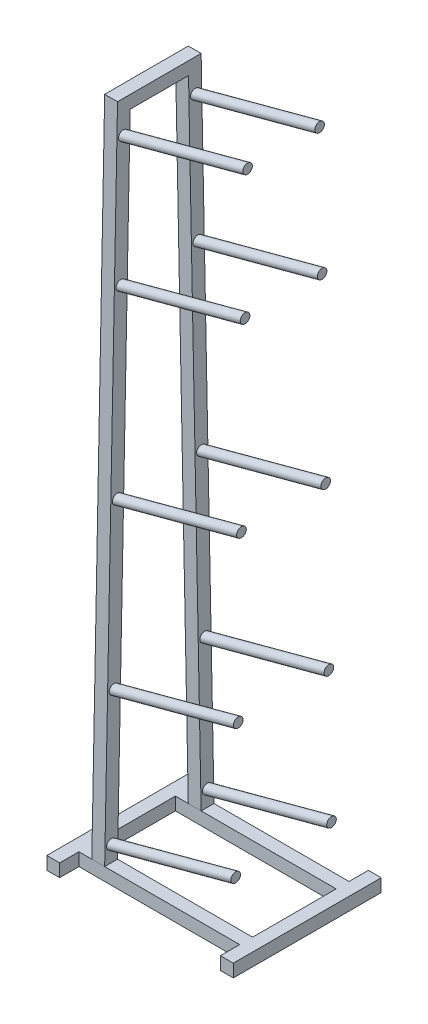
ISO-10303-21;
HEADER;
FILE_DESCRIPTION(('STEP AP214'),'2;1');
FILE_NAME('part.step','',(''),(''),'','','');
FILE_SCHEMA(('AUTOMOTIVE_DESIGN { 1 0 10303 214 1 1 1 1 }'));
ENDSEC;
DATA;
#1=APPLICATION_CONTEXT('core data for automotive mechanical design processes');
#2=APPLICATION_PROTOCOL_DEFINITION('international standard','automotive_design',2000,#1);
#3=PRODUCT_CONTEXT('',#1,'mechanical');
#4=PRODUCT('Part','Part','',(#3));
#5=PRODUCT_RELATED_PRODUCT_CATEGORY('part','',(#4));
#6=PRODUCT_DEFINITION_FORMATION('','',#4);
#7=PRODUCT_DEFINITION_CONTEXT('part definition',#1,'design');
#8=PRODUCT_DEFINITION('design','',#6,#7);
#9=PRODUCT_DEFINITION_SHAPE('','',#8);
#10=(LENGTH_UNIT() NAMED_UNIT(*) SI_UNIT(.MILLI.,.METRE.));
#11=(NAMED_UNIT(*) PLANE_ANGLE_UNIT() SI_UNIT($,.RADIAN.));
#12=(NAMED_UNIT(*) SI_UNIT($,.STERADIAN.) SOLID_ANGLE_UNIT());
#13=UNCERTAINTY_MEASURE_WITH_UNIT(LENGTH_MEASURE(1.E-05),#10,'distance_accuracy_value','');
#14=(GEOMETRIC_REPRESENTATION_CONTEXT(3) GLOBAL_UNCERTAINTY_ASSIGNED_CONTEXT((#13)) GLOBAL_UNIT_ASSIGNED_CONTEXT((#10,
#11,#12)) REPRESENTATION_CONTEXT('',''));
#15=CARTESIAN_POINT('',(0.,0.,0.));
#16=DIRECTION('',(0.,0.,1.));
#17=DIRECTION('',(1.,0.,0.));
#18=AXIS2_PLACEMENT_3D('',#15,#16,#17);
#19=CARTESIAN_POINT('',(0.,25.4,292.1));
#20=DIRECTION('',(0.,-1.,0.));
#21=DIRECTION('',(0.,0.,-1.));
#22=AXIS2_PLACEMENT_3D('',#19,#20,#21);
#23=PLANE('',#22);
#24=DIRECTION('',(0.,0.,1.));
#25=VECTOR('',#24,1.);
#26=CARTESIAN_POINT('',(76.2,25.4,228.595117731815));
#27=LINE('',#26,#25);
#28=CARTESIAN_POINT('',(76.2000000000001,25.4,228.6));
#29=VERTEX_POINT('',#28);
#30=CARTESIAN_POINT('',(76.2000000000001,25.4,254.));
#31=VERTEX_POINT('',#30);
#32=EDGE_CURVE('E63',#29,#31,#27,.T.);
#33=ORIENTED_EDGE('',*,*,#32,.T.);
#34=DIRECTION('',(-1.,0.,0.));
#35=VECTOR('',#34,1.);
#36=CARTESIAN_POINT('',(342.9,25.4,254.));
#37=LINE('',#36,#35);
#38=CARTESIAN_POINT('',(342.9,25.4,254.));
#39=VERTEX_POINT('',#38);
#40=EDGE_CURVE('E424',#39,#31,#37,.T.);
#41=ORIENTED_EDGE('',*,*,#40,.F.);
#42=DIRECTION('',(0.,0.,-1.));
#43=VECTOR('',#42,1.);
#44=CARTESIAN_POINT('',(342.9,25.4,292.1));
#45=LINE('',#44,#43);
#46=CARTESIAN_POINT('',(342.9,25.4,292.1));
#47=VERTEX_POINT('',#46);
#48=EDGE_CURVE('E368',#47,#39,#45,.T.);
#49=ORIENTED_EDGE('',*,*,#48,.F.);
#50=DIRECTION('',(1.,0.,0.));
#51=VECTOR('',#50,1.);
#52=CARTESIAN_POINT('',(368.3,25.4,292.1));
#53=LINE('',#52,#51);
#54=CARTESIAN_POINT('',(368.3,25.4,292.1));
#55=VERTEX_POINT('',#54);
#56=EDGE_CURVE('E331',#47,#55,#53,.T.);
#57=ORIENTED_EDGE('',*,*,#56,.T.);
#58=DIRECTION('',(0.,0.,-1.));
#59=VECTOR('',#58,1.);
#60=CARTESIAN_POINT('',(368.3,25.4,292.1));
#61=LINE('',#60,#59);
#62=CARTESIAN_POINT('',(368.3,25.4,0.));
#63=VERTEX_POINT('',#62);
#64=EDGE_CURVE('E372',#55,#63,#61,.T.);
#65=ORIENTED_EDGE('',*,*,#64,.T.);
#66=DIRECTION('',(1.,0.,0.));
#67=VECTOR('',#66,1.);
#68=CARTESIAN_POINT('',(368.3,25.4,0.));
#69=LINE('',#68,#67);
#70=CARTESIAN_POINT('',(342.9,25.4,0.));
#71=VERTEX_POINT('',#70);
#72=EDGE_CURVE('E348',#71,#63,#69,.T.);
#73=ORIENTED_EDGE('',*,*,#72,.F.);
#74=CARTESIAN_POINT('',(342.9,25.4,38.1));
#75=VERTEX_POINT('',#74);
#76=EDGE_CURVE('E366',#75,#71,#45,.T.);
#77=ORIENTED_EDGE('',*,*,#76,.F.);
#78=DIRECTION('',(-1.,0.,0.));
#79=VECTOR('',#78,1.);
#80=CARTESIAN_POINT('',(342.9,25.4,38.1));
#81=LINE('',#80,#79);
#82=CARTESIAN_POINT('',(76.2000000000001,25.4,38.1));
#83=VERTEX_POINT('',#82);
#84=EDGE_CURVE('E398',#75,#83,#81,.T.);
#85=ORIENTED_EDGE('',*,*,#84,.T.);
#86=DIRECTION('',(0.,0.,1.));
#87=VECTOR('',#86,1.);
#88=CARTESIAN_POINT('',(76.2,25.4,38.1));
#89=LINE('',#88,#87);
#90=CARTESIAN_POINT('',(76.2000000000001,25.4,63.5));
#91=VERTEX_POINT('',#90);
#92=EDGE_CURVE('E228',#83,#91,#89,.T.);
#93=ORIENTED_EDGE('',*,*,#92,.T.);
#94=DIRECTION('',(-1.,0.,0.));
#95=VECTOR('',#94,1.);
#96=CARTESIAN_POINT('',(342.9,25.4,63.5));
#97=LINE('',#96,#95);
#98=CARTESIAN_POINT('',(342.9,25.4,63.5));
#99=VERTEX_POINT('',#98);
#100=EDGE_CURVE('E393',#99,#91,#97,.T.);
#101=ORIENTED_EDGE('',*,*,#100,.F.);
#102=CARTESIAN_POINT('',(342.9,25.4,228.6));
#103=VERTEX_POINT('',#102);
#104=EDGE_CURVE('E373',#103,#99,#45,.T.);
#105=ORIENTED_EDGE('',*,*,#104,.F.);
#106=DIRECTION('',(-1.,0.,0.));
#107=VECTOR('',#106,1.);
#108=CARTESIAN_POINT('',(342.9,25.4,228.6));
#109=LINE('',#108,#107);
#110=EDGE_CURVE('E428',#103,#29,#109,.T.);
#111=ORIENTED_EDGE('',*,*,#110,.T.);
#112=EDGE_LOOP('',(#33,#41,#49,#57,#65,#73,#77,#85,#93,#101,#105,#111));
#113=FACE_BOUND('',#112,.T.);
#114=ADVANCED_FACE('F39',(#113),#23,.F.);
#115=CARTESIAN_POINT('',(25.4,0.,292.1));
#116=DIRECTION('',(-1.,0.,0.));
#117=DIRECTION('',(0.,0.,1.));
#118=AXIS2_PLACEMENT_3D('',#115,#116,#117);
#119=PLANE('',#118);
#120=DIRECTION('',(0.,-1.,0.));
#121=VECTOR('',#120,1.);
#122=CARTESIAN_POINT('',(25.4,25.4,63.5));
#123=LINE('',#122,#121);
#124=CARTESIAN_POINT('',(25.4,25.4,63.5));
#125=VERTEX_POINT('',#124);
#126=CARTESIAN_POINT('',(25.4,0.,63.5));
#127=VERTEX_POINT('',#126);
#128=EDGE_CURVE('E376',#125,#127,#123,.T.);
#129=ORIENTED_EDGE('',*,*,#128,.F.);
#130=DIRECTION('',(0.,0.,-1.));
#131=VECTOR('',#130,1.);
#132=CARTESIAN_POINT('',(25.4,25.4,292.1));
#133=LINE('',#132,#131);
#134=CARTESIAN_POINT('',(25.4,25.4,228.6));
#135=VERTEX_POINT('',#134);
#136=EDGE_CURVE('E477',#135,#125,#133,.T.);
#137=ORIENTED_EDGE('',*,*,#136,.F.);
#138=DIRECTION('',(0.,1.,0.));
#139=VECTOR('',#138,1.);
#140=CARTESIAN_POINT('',(25.4,25.4,228.6));
#141=LINE('',#140,#139);
#142=CARTESIAN_POINT('',(25.4,0.,228.6));
#143=VERTEX_POINT('',#142);
#144=EDGE_CURVE('E414',#143,#135,#141,.T.);
#145=ORIENTED_EDGE('',*,*,#144,.F.);
#146=DIRECTION('',(0.,0.,-1.));
#147=VECTOR('',#146,1.);
#148=CARTESIAN_POINT('',(25.4,0.,292.1));
#149=LINE('',#148,#147);
#150=EDGE_CURVE('E482',#143,#127,#149,.T.);
#151=ORIENTED_EDGE('',*,*,#150,.T.);
#152=EDGE_LOOP('',(#129,#137,#145,#151));
#153=FACE_BOUND('',#152,.T.);
#154=ADVANCED_FACE('F530',(#153),#119,.F.);
#155=DIRECTION('',(0.,1.,0.));
#156=VECTOR('',#155,1.);
#157=CARTESIAN_POINT('',(25.4,25.4,38.1));
#158=LINE('',#157,#156);
#159=CARTESIAN_POINT('',(25.4,0.,38.1));
#160=VERTEX_POINT('',#159);
#161=CARTESIAN_POINT('',(25.4,25.4,38.1));
#162=VERTEX_POINT('',#161);
#163=EDGE_CURVE('E382',#160,#162,#158,.T.);
#164=ORIENTED_EDGE('',*,*,#163,.F.);
#165=CARTESIAN_POINT('',(25.4,0.,0.));
#166=VERTEX_POINT('',#165);
#167=EDGE_CURVE('E476',#160,#166,#149,.T.);
#168=ORIENTED_EDGE('',*,*,#167,.T.);
#169=DIRECTION('',(0.,1.,0.));
#170=VECTOR('',#169,1.);
#171=CARTESIAN_POINT('',(25.4,0.,0.));
#172=LINE('',#171,#170);
#173=CARTESIAN_POINT('',(25.4,25.4,0.));
#174=VERTEX_POINT('',#173);
#175=EDGE_CURVE('E463',#166,#174,#172,.T.);
#176=ORIENTED_EDGE('',*,*,#175,.T.);
#177=EDGE_CURVE('E472',#162,#174,#133,.T.);
#178=ORIENTED_EDGE('',*,*,#177,.F.);
#179=EDGE_LOOP('',(#164,#168,#176,#178));
#180=FACE_BOUND('',#179,.T.);
#181=ADVANCED_FACE('F536',(#180),#119,.F.);
#182=DIRECTION('',(0.,-1.,0.));
#183=VECTOR('',#182,1.);
#184=CARTESIAN_POINT('',(25.4,25.4,254.));
#185=LINE('',#184,#183);
#186=CARTESIAN_POINT('',(25.4,25.4,254.));
#187=VERTEX_POINT('',#186);
#188=CARTESIAN_POINT('',(25.4,0.,254.));
#189=VERTEX_POINT('',#188);
#190=EDGE_CURVE('E408',#187,#189,#185,.T.);
#191=ORIENTED_EDGE('',*,*,#190,.F.);
#192=CARTESIAN_POINT('',(25.4,25.4,292.1));
#193=VERTEX_POINT('',#192);
#194=EDGE_CURVE('E473',#193,#187,#133,.T.);
#195=ORIENTED_EDGE('',*,*,#194,.F.);
#196=DIRECTION('',(0.,1.,0.));
#197=VECTOR('',#196,1.);
#198=CARTESIAN_POINT('',(25.4,0.,292.1));
#199=LINE('',#198,#197);
#200=CARTESIAN_POINT('',(25.4,0.,292.1));
#201=VERTEX_POINT('',#200);
#202=EDGE_CURVE('E449',#201,#193,#199,.T.);
#203=ORIENTED_EDGE('',*,*,#202,.F.);
#204=EDGE_CURVE('E478',#201,#189,#149,.T.);
#205=ORIENTED_EDGE('',*,*,#204,.T.);
#206=EDGE_LOOP('',(#191,#195,#203,#205));
#207=FACE_BOUND('',#206,.T.);
#208=ADVANCED_FACE('F539',(#207),#119,.F.);
#209=CARTESIAN_POINT('',(0.,0.,292.1));
#210=DIRECTION('',(1.,0.,0.));
#211=DIRECTION('',(0.,0.,-1.));
#212=AXIS2_PLACEMENT_3D('',#209,#210,#211);
#213=PLANE('',#212);
#214=DIRECTION('',(0.,-1.,0.));
#215=VECTOR('',#214,1.);
#216=CARTESIAN_POINT('',(0.,0.,0.));
#217=LINE('',#216,#215);
#218=CARTESIAN_POINT('',(0.,25.4,0.));
#219=VERTEX_POINT('',#218);
#220=CARTESIAN_POINT('',(0.,0.,0.));
#221=VERTEX_POINT('',#220);
#222=EDGE_CURVE('E440',#219,#221,#217,.T.);
#223=ORIENTED_EDGE('',*,*,#222,.T.);
#224=DIRECTION('',(0.,0.,-1.));
#225=VECTOR('',#224,1.);
#226=CARTESIAN_POINT('',(0.,0.,292.1));
#227=LINE('',#226,#225);
#228=CARTESIAN_POINT('',(0.,0.,292.1));
#229=VERTEX_POINT('',#228);
#230=EDGE_CURVE('E481',#229,#221,#227,.T.);
#231=ORIENTED_EDGE('',*,*,#230,.F.);
#232=DIRECTION('',(0.,-1.,0.));
#233=VECTOR('',#232,1.);
#234=CARTESIAN_POINT('',(0.,0.,292.1));
#235=LINE('',#234,#233);
#236=CARTESIAN_POINT('',(0.,25.4,292.1));
#237=VERTEX_POINT('',#236);
#238=EDGE_CURVE('E441',#237,#229,#235,.T.);
#239=ORIENTED_EDGE('',*,*,#238,.F.);
#240=DIRECTION('',(0.,0.,-1.));
#241=VECTOR('',#240,1.);
#242=CARTESIAN_POINT('',(0.,25.4,292.1));
#243=LINE('',#242,#241);
#244=EDGE_CURVE('E455',#237,#219,#243,.T.);
#245=ORIENTED_EDGE('',*,*,#244,.T.);
#246=EDGE_LOOP('',(#223,#231,#239,#245));
#247=FACE_BOUND('',#246,.T.);
#248=ADVANCED_FACE('F41',(#247),#213,.F.);
#249=CARTESIAN_POINT('',(0.,0.,292.1));
#250=DIRECTION('',(0.,1.,0.));
#251=DIRECTION('',(0.,0.,1.));
#252=AXIS2_PLACEMENT_3D('',#249,#250,#251);
#253=PLANE('',#252);
#254=DIRECTION('',(-1.,0.,0.));
#255=VECTOR('',#254,1.);
#256=CARTESIAN_POINT('',(342.9,0.,228.6));
#257=LINE('',#256,#255);
#258=CARTESIAN_POINT('',(342.9,0.,228.6));
#259=VERTEX_POINT('',#258);
#260=EDGE_CURVE('E431',#259,#143,#257,.T.);
#261=ORIENTED_EDGE('',*,*,#260,.F.);
#262=DIRECTION('',(0.,0.,-1.));
#263=VECTOR('',#262,1.);
#264=CARTESIAN_POINT('',(342.9,0.,292.1));
#265=LINE('',#264,#263);
#266=CARTESIAN_POINT('',(342.9,0.,63.5));
#267=VERTEX_POINT('',#266);
#268=EDGE_CURVE('E367',#259,#267,#265,.T.);
#269=ORIENTED_EDGE('',*,*,#268,.T.);
#270=DIRECTION('',(-1.,0.,0.));
#271=VECTOR('',#270,1.);
#272=CARTESIAN_POINT('',(342.9,0.,63.5));
#273=LINE('',#272,#271);
#274=EDGE_CURVE('E405',#267,#127,#273,.T.);
#275=ORIENTED_EDGE('',*,*,#274,.T.);
#276=ORIENTED_EDGE('',*,*,#150,.F.);
#277=EDGE_LOOP('',(#261,#269,#275,#276));
#278=FACE_BOUND('',#277,.T.);
#279=DIRECTION('',(1.,0.,0.));
#280=VECTOR('',#279,1.);
#281=CARTESIAN_POINT('',(0.,0.,0.));
#282=LINE('',#281,#280);
#283=EDGE_CURVE('E459',#221,#166,#282,.T.);
#284=ORIENTED_EDGE('',*,*,#283,.T.);
#285=ORIENTED_EDGE('',*,*,#167,.F.);
#286=DIRECTION('',(-1.,0.,0.));
#287=VECTOR('',#286,1.);
#288=CARTESIAN_POINT('',(342.9,0.,38.1));
#289=LINE('',#288,#287);
#290=CARTESIAN_POINT('',(342.9,0.,38.1));
#291=VERTEX_POINT('',#290);
#292=EDGE_CURVE('E402',#291,#160,#289,.T.);
#293=ORIENTED_EDGE('',*,*,#292,.F.);
#294=CARTESIAN_POINT('',(342.9,0.,0.));
#295=VERTEX_POINT('',#294);
#296=EDGE_CURVE('E361',#291,#295,#265,.T.);
#297=ORIENTED_EDGE('',*,*,#296,.T.);
#298=DIRECTION('',(-1.,0.,0.));
#299=VECTOR('',#298,1.);
#300=CARTESIAN_POINT('',(368.3,0.,0.));
#301=LINE('',#300,#299);
#302=CARTESIAN_POINT('',(368.3,0.,0.));
#303=VERTEX_POINT('',#302);
#304=EDGE_CURVE('E332',#303,#295,#301,.T.);
#305=ORIENTED_EDGE('',*,*,#304,.F.);
#306=DIRECTION('',(0.,0.,-1.));
#307=VECTOR('',#306,1.);
#308=CARTESIAN_POINT('',(368.3,0.,292.1));
#309=LINE('',#308,#307);
#310=CARTESIAN_POINT('',(368.3,0.,292.1));
#311=VERTEX_POINT('',#310);
#312=EDGE_CURVE('E344',#311,#303,#309,.T.);
#313=ORIENTED_EDGE('',*,*,#312,.F.);
#314=DIRECTION('',(-1.,0.,0.));
#315=VECTOR('',#314,1.);
#316=CARTESIAN_POINT('',(368.3,0.,292.1));
#317=LINE('',#316,#315);
#318=CARTESIAN_POINT('',(342.9,0.,292.1));
#319=VERTEX_POINT('',#318);
#320=EDGE_CURVE('E340',#311,#319,#317,.T.);
#321=ORIENTED_EDGE('',*,*,#320,.T.);
#322=CARTESIAN_POINT('',(342.9,0.,254.));
#323=VERTEX_POINT('',#322);
#324=EDGE_CURVE('E362',#319,#323,#265,.T.);
#325=ORIENTED_EDGE('',*,*,#324,.T.);
#326=DIRECTION('',(-1.,0.,0.));
#327=VECTOR('',#326,1.);
#328=CARTESIAN_POINT('',(342.9,0.,254.));
#329=LINE('',#328,#327);
#330=EDGE_CURVE('E436',#323,#189,#329,.T.);
#331=ORIENTED_EDGE('',*,*,#330,.T.);
#332=ORIENTED_EDGE('',*,*,#204,.F.);
#333=DIRECTION('',(1.,0.,0.));
#334=VECTOR('',#333,1.);
#335=CARTESIAN_POINT('',(0.,0.,292.1));
#336=LINE('',#335,#334);
#337=EDGE_CURVE('E445',#229,#201,#336,.T.);
#338=ORIENTED_EDGE('',*,*,#337,.F.);
#339=ORIENTED_EDGE('',*,*,#230,.T.);
#340=EDGE_LOOP('',(#284,#285,#293,#297,#305,#313,#321,#325,#331,#332,#338,#339));
#341=FACE_BOUND('',#340,.T.);
#342=ADVANCED_FACE('F543',(#278,#341),#253,.F.);
#343=CARTESIAN_POINT('',(50.8000000000001,25.4,254.));
#344=VERTEX_POINT('',#343);
#345=EDGE_CURVE('E55',#344,#187,#37,.T.);
#346=ORIENTED_EDGE('',*,*,#345,.F.);
#347=DIRECTION('',(0.,0.,1.));
#348=VECTOR('',#347,1.);
#349=CARTESIAN_POINT('',(50.8,25.4,228.595117731815));
#350=LINE('',#349,#348);
#351=CARTESIAN_POINT('',(50.8,25.4,228.6));
#352=VERTEX_POINT('',#351);
#353=EDGE_CURVE('E286',#352,#344,#350,.T.);
#354=ORIENTED_EDGE('',*,*,#353,.F.);
#355=EDGE_CURVE('E427',#352,#135,#109,.T.);
#356=ORIENTED_EDGE('',*,*,#355,.T.);
#357=ORIENTED_EDGE('',*,*,#136,.T.);
#358=CARTESIAN_POINT('',(50.8000000000001,25.4,63.5));
#359=VERTEX_POINT('',#358);
#360=EDGE_CURVE('E386',#359,#125,#97,.T.);
#361=ORIENTED_EDGE('',*,*,#360,.F.);
#362=DIRECTION('',(0.,0.,1.));
#363=VECTOR('',#362,1.);
#364=CARTESIAN_POINT('',(50.8,25.4,38.1));
#365=LINE('',#364,#363);
#366=CARTESIAN_POINT('',(50.8,25.4,38.1));
#367=VERTEX_POINT('',#366);
#368=EDGE_CURVE('E271',#367,#359,#365,.T.);
#369=ORIENTED_EDGE('',*,*,#368,.F.);
#370=EDGE_CURVE('E397',#367,#162,#81,.T.);
#371=ORIENTED_EDGE('',*,*,#370,.T.);
#372=ORIENTED_EDGE('',*,*,#177,.T.);
#373=DIRECTION('',(-1.,0.,0.));
#374=VECTOR('',#373,1.);
#375=CARTESIAN_POINT('',(0.,25.4,0.));
#376=LINE('',#375,#374);
#377=EDGE_CURVE('E446',#174,#219,#376,.T.);
#378=ORIENTED_EDGE('',*,*,#377,.T.);
#379=ORIENTED_EDGE('',*,*,#244,.F.);
#380=DIRECTION('',(-1.,0.,0.));
#381=VECTOR('',#380,1.);
#382=CARTESIAN_POINT('',(0.,25.4,292.1));
#383=LINE('',#382,#381);
#384=EDGE_CURVE('E452',#193,#237,#383,.T.);
#385=ORIENTED_EDGE('',*,*,#384,.F.);
#386=ORIENTED_EDGE('',*,*,#194,.T.);
#387=EDGE_LOOP('',(#346,#354,#356,#357,#361,#369,#371,#372,#378,#379,#385,#386));
#388=FACE_BOUND('',#387,.T.);
#389=ADVANCED_FACE('F532',(#388),#23,.F.);
#390=CARTESIAN_POINT('',(0.,0.,292.1));
#391=DIRECTION('',(0.,0.,-1.));
#392=DIRECTION('',(-1.,0.,0.));
#393=AXIS2_PLACEMENT_3D('',#390,#391,#392);
#394=PLANE('',#393);
#395=ORIENTED_EDGE('',*,*,#238,.T.);
#396=ORIENTED_EDGE('',*,*,#337,.T.);
#397=ORIENTED_EDGE('',*,*,#202,.T.);
#398=ORIENTED_EDGE('',*,*,#384,.T.);
#399=EDGE_LOOP('',(#395,#396,#397,#398));
#400=FACE_BOUND('',#399,.T.);
#401=ADVANCED_FACE('F542',(#400),#394,.F.);
#402=CARTESIAN_POINT('',(0.,0.,0.));
#403=DIRECTION('',(0.,0.,-1.));
#404=DIRECTION('',(-1.,0.,0.));
#405=AXIS2_PLACEMENT_3D('',#402,#403,#404);
#406=PLANE('',#405);
#407=ORIENTED_EDGE('',*,*,#222,.F.);
#408=ORIENTED_EDGE('',*,*,#377,.F.);
#409=ORIENTED_EDGE('',*,*,#175,.F.);
#410=ORIENTED_EDGE('',*,*,#283,.F.);
#411=EDGE_LOOP('',(#407,#408,#409,#410));
#412=FACE_BOUND('',#411,.T.);
#413=ADVANCED_FACE('F548',(#412),#406,.T.);
#414=CARTESIAN_POINT('',(342.9,25.4,254.));
#415=DIRECTION('',(0.,0.,-1.));
#416=DIRECTION('',(-1.,0.,0.));
#417=AXIS2_PLACEMENT_3D('',#414,#415,#416);
#418=PLANE('',#417);
#419=ORIENTED_EDGE('',*,*,#190,.T.);
#420=ORIENTED_EDGE('',*,*,#330,.F.);
#421=DIRECTION('',(0.,-1.,0.));
#422=VECTOR('',#421,1.);
#423=CARTESIAN_POINT('',(342.9,25.4,254.));
#424=LINE('',#423,#422);
#425=EDGE_CURVE('E409',#39,#323,#424,.T.);
#426=ORIENTED_EDGE('',*,*,#425,.F.);
#427=ORIENTED_EDGE('',*,*,#40,.T.);
#428=DIRECTION('',(-1.,0.,0.));
#429=VECTOR('',#428,1.);
#430=CARTESIAN_POINT('',(76.2,25.4,254.));
#431=LINE('',#430,#429);
#432=EDGE_CURVE('E313',#31,#344,#431,.T.);
#433=ORIENTED_EDGE('',*,*,#432,.T.);
#434=ORIENTED_EDGE('',*,*,#345,.T.);
#435=EDGE_LOOP('',(#419,#420,#426,#427,#433,#434));
#436=FACE_BOUND('',#435,.T.);
#437=ADVANCED_FACE('F574',(#436),#418,.F.);
#438=CARTESIAN_POINT('',(342.9,25.4,228.6));
#439=DIRECTION('',(0.,0.,1.));
#440=DIRECTION('',(1.,0.,0.));
#441=AXIS2_PLACEMENT_3D('',#438,#439,#440);
#442=PLANE('',#441);
#443=ORIENTED_EDGE('',*,*,#144,.T.);
#444=ORIENTED_EDGE('',*,*,#355,.F.);
#445=EDGE_CURVE('E432',#29,#352,#109,.T.);
#446=ORIENTED_EDGE('',*,*,#445,.F.);
#447=ORIENTED_EDGE('',*,*,#110,.F.);
#448=DIRECTION('',(0.,1.,0.));
#449=VECTOR('',#448,1.);
#450=CARTESIAN_POINT('',(342.9,25.4,228.6));
#451=LINE('',#450,#449);
#452=EDGE_CURVE('E413',#259,#103,#451,.T.);
#453=ORIENTED_EDGE('',*,*,#452,.F.);
#454=ORIENTED_EDGE('',*,*,#260,.T.);
#455=EDGE_LOOP('',(#443,#444,#446,#447,#453,#454));
#456=FACE_BOUND('',#455,.T.);
#457=ADVANCED_FACE('F625',(#456),#442,.F.);
#458=CARTESIAN_POINT('',(342.9,25.4,63.5));
#459=DIRECTION('',(0.,0.,-1.));
#460=DIRECTION('',(0.,1.,0.));
#461=AXIS2_PLACEMENT_3D('',#458,#459,#460);
#462=PLANE('',#461);
#463=ORIENTED_EDGE('',*,*,#128,.T.);
#464=ORIENTED_EDGE('',*,*,#274,.F.);
#465=DIRECTION('',(0.,-1.,0.));
#466=VECTOR('',#465,1.);
#467=CARTESIAN_POINT('',(342.9,25.4,63.5));
#468=LINE('',#467,#466);
#469=EDGE_CURVE('E377',#99,#267,#468,.T.);
#470=ORIENTED_EDGE('',*,*,#469,.F.);
#471=ORIENTED_EDGE('',*,*,#100,.T.);
#472=DIRECTION('',(-1.,0.,0.));
#473=VECTOR('',#472,1.);
#474=CARTESIAN_POINT('',(342.9,25.4,63.5));
#475=LINE('',#474,#473);
#476=EDGE_CURVE('E223',#91,#359,#475,.T.);
#477=ORIENTED_EDGE('',*,*,#476,.T.);
#478=ORIENTED_EDGE('',*,*,#360,.T.);
#479=EDGE_LOOP('',(#463,#464,#470,#471,#477,#478));
#480=FACE_BOUND('',#479,.T.);
#481=ADVANCED_FACE('F605',(#480),#462,.F.);
#482=CARTESIAN_POINT('',(342.9,25.4,38.1));
#483=DIRECTION('',(0.,0.,1.));
#484=DIRECTION('',(1.,0.,0.));
#485=AXIS2_PLACEMENT_3D('',#482,#483,#484);
#486=PLANE('',#485);
#487=ORIENTED_EDGE('',*,*,#163,.T.);
#488=ORIENTED_EDGE('',*,*,#370,.F.);
#489=DIRECTION('',(-1.,0.,0.));
#490=VECTOR('',#489,1.);
#491=CARTESIAN_POINT('',(76.2,25.4,38.1));
#492=LINE('',#491,#490);
#493=EDGE_CURVE('E302',#83,#367,#492,.T.);
#494=ORIENTED_EDGE('',*,*,#493,.F.);
#495=ORIENTED_EDGE('',*,*,#84,.F.);
#496=DIRECTION('',(0.,1.,0.));
#497=VECTOR('',#496,1.);
#498=CARTESIAN_POINT('',(342.9,25.4,38.1));
#499=LINE('',#498,#497);
#500=EDGE_CURVE('E381',#291,#75,#499,.T.);
#501=ORIENTED_EDGE('',*,*,#500,.F.);
#502=ORIENTED_EDGE('',*,*,#292,.T.);
#503=EDGE_LOOP('',(#487,#488,#494,#495,#501,#502));
#504=FACE_BOUND('',#503,.T.);
#505=ADVANCED_FACE('F615',(#504),#486,.F.);
#506=CARTESIAN_POINT('',(342.9,0.,292.1));
#507=DIRECTION('',(-1.,0.,0.));
#508=DIRECTION('',(0.,0.,1.));
#509=AXIS2_PLACEMENT_3D('',#506,#507,#508);
#510=PLANE('',#509);
#511=ORIENTED_EDGE('',*,*,#425,.T.);
#512=ORIENTED_EDGE('',*,*,#324,.F.);
#513=DIRECTION('',(0.,1.,0.));
#514=VECTOR('',#513,1.);
#515=CARTESIAN_POINT('',(342.9,0.,292.1));
#516=LINE('',#515,#514);
#517=EDGE_CURVE('E336',#319,#47,#516,.T.);
#518=ORIENTED_EDGE('',*,*,#517,.T.);
#519=ORIENTED_EDGE('',*,*,#48,.T.);
#520=EDGE_LOOP('',(#511,#512,#518,#519));
#521=FACE_BOUND('',#520,.T.);
#522=ADVANCED_FACE('F576',(#521),#510,.T.);
#523=ORIENTED_EDGE('',*,*,#452,.T.);
#524=ORIENTED_EDGE('',*,*,#104,.T.);
#525=ORIENTED_EDGE('',*,*,#469,.T.);
#526=ORIENTED_EDGE('',*,*,#268,.F.);
#527=EDGE_LOOP('',(#523,#524,#525,#526));
#528=FACE_BOUND('',#527,.T.);
#529=ADVANCED_FACE('F600',(#528),#510,.T.);
#530=ORIENTED_EDGE('',*,*,#500,.T.);
#531=ORIENTED_EDGE('',*,*,#76,.T.);
#532=DIRECTION('',(0.,1.,0.));
#533=VECTOR('',#532,1.);
#534=CARTESIAN_POINT('',(342.9,0.,0.));
#535=LINE('',#534,#533);
#536=EDGE_CURVE('E352',#295,#71,#535,.T.);
#537=ORIENTED_EDGE('',*,*,#536,.F.);
#538=ORIENTED_EDGE('',*,*,#296,.F.);
#539=EDGE_LOOP('',(#530,#531,#537,#538));
#540=FACE_BOUND('',#539,.T.);
#541=ADVANCED_FACE('F594',(#540),#510,.T.);
#542=CARTESIAN_POINT('',(368.3,0.,292.1));
#543=DIRECTION('',(1.,0.,0.));
#544=DIRECTION('',(0.,0.,-1.));
#545=AXIS2_PLACEMENT_3D('',#542,#543,#544);
#546=PLANE('',#545);
#547=DIRECTION('',(0.,-1.,0.));
#548=VECTOR('',#547,1.);
#549=CARTESIAN_POINT('',(368.3,0.,0.));
#550=LINE('',#549,#548);
#551=EDGE_CURVE('E326',#63,#303,#550,.T.);
#552=ORIENTED_EDGE('',*,*,#551,.F.);
#553=ORIENTED_EDGE('',*,*,#64,.F.);
#554=DIRECTION('',(0.,-1.,0.));
#555=VECTOR('',#554,1.);
#556=CARTESIAN_POINT('',(368.3,0.,292.1));
#557=LINE('',#556,#555);
#558=EDGE_CURVE('E327',#55,#311,#557,.T.);
#559=ORIENTED_EDGE('',*,*,#558,.T.);
#560=ORIENTED_EDGE('',*,*,#312,.T.);
#561=EDGE_LOOP('',(#552,#553,#559,#560));
#562=FACE_BOUND('',#561,.T.);
#563=ADVANCED_FACE('F585',(#562),#546,.T.);
#564=CARTESIAN_POINT('',(368.3,0.,292.1));
#565=DIRECTION('',(0.,0.,-1.));
#566=DIRECTION('',(1.,0.,0.));
#567=AXIS2_PLACEMENT_3D('',#564,#565,#566);
#568=PLANE('',#567);
#569=ORIENTED_EDGE('',*,*,#558,.F.);
#570=ORIENTED_EDGE('',*,*,#56,.F.);
#571=ORIENTED_EDGE('',*,*,#517,.F.);
#572=ORIENTED_EDGE('',*,*,#320,.F.);
#573=EDGE_LOOP('',(#569,#570,#571,#572));
#574=FACE_BOUND('',#573,.T.);
#575=ADVANCED_FACE('F581',(#574),#568,.F.);
#576=CARTESIAN_POINT('',(368.3,0.,0.));
#577=DIRECTION('',(0.,0.,-1.));
#578=DIRECTION('',(1.,0.,0.));
#579=AXIS2_PLACEMENT_3D('',#576,#577,#578);
#580=PLANE('',#579);
#581=ORIENTED_EDGE('',*,*,#551,.T.);
#582=ORIENTED_EDGE('',*,*,#304,.T.);
#583=ORIENTED_EDGE('',*,*,#536,.T.);
#584=ORIENTED_EDGE('',*,*,#72,.T.);
#585=EDGE_LOOP('',(#581,#582,#583,#584));
#586=FACE_BOUND('',#585,.T.);
#587=ADVANCED_FACE('F590',(#586),#580,.T.);
#588=CARTESIAN_POINT('',(76.2,25.4,228.595117731815));
#589=DIRECTION('',(0.,-1.,0.));
#590=DIRECTION('',(0.,0.,-1.));
#591=AXIS2_PLACEMENT_3D('',#588,#589,#590);
#592=PLANE('',#591);
#593=ORIENTED_EDGE('',*,*,#445,.T.);
#594=CARTESIAN_POINT('',(50.8,25.4,228.595117731815));
#595=VERTEX_POINT('',#594);
#596=EDGE_CURVE('E287',#595,#352,#350,.T.);
#597=ORIENTED_EDGE('',*,*,#596,.F.);
#598=DIRECTION('',(-1.,0.,0.));
#599=VECTOR('',#598,1.);
#600=CARTESIAN_POINT('',(76.2,25.4,228.595117731815));
#601=LINE('',#600,#599);
#602=CARTESIAN_POINT('',(76.2,25.4,228.595117731815));
#603=VERTEX_POINT('',#602);
#604=EDGE_CURVE('E316',#603,#595,#601,.T.);
#605=ORIENTED_EDGE('',*,*,#604,.F.);
#606=EDGE_CURVE('E257',#603,#29,#27,.T.);
#607=ORIENTED_EDGE('',*,*,#606,.T.);
#608=EDGE_LOOP('',(#593,#597,#605,#607));
#609=FACE_BOUND('',#608,.T.);
#610=ADVANCED_FACE('F980',(#609),#592,.T.);
#611=CARTESIAN_POINT('',(76.2,25.4,38.1));
#612=DIRECTION('',(0.,-1.,0.));
#613=DIRECTION('',(0.,0.,-1.));
#614=AXIS2_PLACEMENT_3D('',#611,#612,#613);
#615=PLANE('',#614);
#616=ORIENTED_EDGE('',*,*,#476,.F.);
#617=CARTESIAN_POINT('',(76.2,25.4,63.5048822681854));
#618=VERTEX_POINT('',#617);
#619=EDGE_CURVE('E216',#91,#618,#89,.T.);
#620=ORIENTED_EDGE('',*,*,#619,.T.);
#621=DIRECTION('',(-1.,0.,0.));
#622=VECTOR('',#621,1.);
#623=CARTESIAN_POINT('',(76.2,25.4,63.5048822681854));
#624=LINE('',#623,#622);
#625=CARTESIAN_POINT('',(50.8,25.4,63.5048822681854));
#626=VERTEX_POINT('',#625);
#627=EDGE_CURVE('E220',#618,#626,#624,.T.);
#628=ORIENTED_EDGE('',*,*,#627,.T.);
#629=EDGE_CURVE('E275',#359,#626,#365,.T.);
#630=ORIENTED_EDGE('',*,*,#629,.F.);
#631=EDGE_LOOP('',(#616,#620,#628,#630));
#632=FACE_BOUND('',#631,.T.);
#633=ADVANCED_FACE('F218',(#632),#615,.T.);
#634=CARTESIAN_POINT('',(76.2,25.4,38.1));
#635=DIRECTION('',(0.,0.0196040749344456,-0.999807821656724));
#636=DIRECTION('',(0.,0.999807821656725,0.0196040749344456));
#637=AXIS2_PLACEMENT_3D('',#634,#635,#636);
#638=PLANE('',#637);
#639=DIRECTION('',(0.,-0.999807821656724,-0.0196040749344456));
#640=VECTOR('',#639,1.);
#641=CARTESIAN_POINT('',(50.8,25.4,38.1));
#642=LINE('',#641,#640);
#643=CARTESIAN_POINT('',(50.8,1320.8,63.5));
#644=VERTEX_POINT('',#643);
#645=EDGE_CURVE('E229',#644,#367,#642,.T.);
#646=ORIENTED_EDGE('',*,*,#645,.F.);
#647=DIRECTION('',(-1.,0.,0.));
#648=VECTOR('',#647,1.);
#649=CARTESIAN_POINT('',(76.2,1320.8,63.5));
#650=LINE('',#649,#648);
#651=CARTESIAN_POINT('',(76.2,1320.8,63.5));
#652=VERTEX_POINT('',#651);
#653=EDGE_CURVE('E306',#652,#644,#650,.T.);
#654=ORIENTED_EDGE('',*,*,#653,.F.);
#655=DIRECTION('',(0.,-0.999807821656724,-0.0196040749344456));
#656=VECTOR('',#655,1.);
#657=CARTESIAN_POINT('',(76.2,25.4,38.1));
#658=LINE('',#657,#656);
#659=EDGE_CURVE('E239',#652,#83,#658,.T.);
#660=ORIENTED_EDGE('',*,*,#659,.T.);
#661=ORIENTED_EDGE('',*,*,#493,.T.);
#662=EDGE_LOOP('',(#646,#654,#660,#661));
#663=FACE_BOUND('',#662,.T.);
#664=ADVANCED_FACE('F638',(#663),#638,.T.);
#665=CARTESIAN_POINT('',(76.2,1320.8,63.5));
#666=DIRECTION('',(0.,1.,0.));
#667=DIRECTION('',(0.,0.,1.));
#668=AXIS2_PLACEMENT_3D('',#665,#666,#667);
#669=PLANE('',#668);
#670=DIRECTION('',(0.,0.,-1.));
#671=VECTOR('',#670,1.);
#672=CARTESIAN_POINT('',(50.8,1320.8,63.5));
#673=LINE('',#672,#671);
#674=CARTESIAN_POINT('',(50.8,1320.8,228.6));
#675=VERTEX_POINT('',#674);
#676=EDGE_CURVE('E295',#675,#644,#673,.T.);
#677=ORIENTED_EDGE('',*,*,#676,.F.);
#678=DIRECTION('',(-1.,0.,0.));
#679=VECTOR('',#678,1.);
#680=CARTESIAN_POINT('',(76.2,1320.8,228.6));
#681=LINE('',#680,#679);
#682=CARTESIAN_POINT('',(76.2,1320.8,228.6));
#683=VERTEX_POINT('',#682);
#684=EDGE_CURVE('E309',#683,#675,#681,.T.);
#685=ORIENTED_EDGE('',*,*,#684,.F.);
#686=DIRECTION('',(0.,0.,-1.));
#687=VECTOR('',#686,1.);
#688=CARTESIAN_POINT('',(76.2,1320.8,203.195117731815));
#689=LINE('',#688,#687);
#690=EDGE_CURVE('E265',#683,#652,#689,.T.);
#691=ORIENTED_EDGE('',*,*,#690,.T.);
#692=ORIENTED_EDGE('',*,*,#653,.T.);
#693=EDGE_LOOP('',(#677,#685,#691,#692));
#694=FACE_BOUND('',#693,.T.);
#695=ADVANCED_FACE('F953',(#694),#669,.T.);
#696=CARTESIAN_POINT('',(76.2,25.4,254.));
#697=DIRECTION('',(0.,0.0196040749344456,0.999807821656724));
#698=DIRECTION('',(0.,-0.999807821656725,0.0196040749344456));
#699=AXIS2_PLACEMENT_3D('',#696,#697,#698);
#700=PLANE('',#699);
#701=DIRECTION('',(0.,0.999807821656724,-0.0196040749344456));
#702=VECTOR('',#701,1.);
#703=CARTESIAN_POINT('',(50.8,25.4,254.));
#704=LINE('',#703,#702);
#705=EDGE_CURVE('E291',#344,#675,#704,.T.);
#706=ORIENTED_EDGE('',*,*,#705,.F.);
#707=ORIENTED_EDGE('',*,*,#432,.F.);
#708=DIRECTION('',(0.,0.999807821656724,-0.0196040749344456));
#709=VECTOR('',#708,1.);
#710=CARTESIAN_POINT('',(76.2,25.4,254.));
#711=LINE('',#710,#709);
#712=EDGE_CURVE('E261',#31,#683,#711,.T.);
#713=ORIENTED_EDGE('',*,*,#712,.T.);
#714=ORIENTED_EDGE('',*,*,#684,.T.);
#715=EDGE_LOOP('',(#706,#707,#713,#714));
#716=FACE_BOUND('',#715,.T.);
#717=ADVANCED_FACE('F647',(#716),#700,.T.);
#718=CARTESIAN_POINT('',(76.2,25.4,228.595117731815));
#719=DIRECTION('',(0.,-0.0196040749344456,-0.999807821656724));
#720=DIRECTION('',(0.,0.999807821656725,-0.0196040749344456));
#721=AXIS2_PLACEMENT_3D('',#718,#719,#720);
#722=PLANE('',#721);
#723=DIRECTION('',(0.,-0.999807821656724,0.0196040749344456));
#724=VECTOR('',#723,1.);
#725=CARTESIAN_POINT('',(50.8,25.4,228.595117731815));
#726=LINE('',#725,#724);
#727=CARTESIAN_POINT('',(50.8,1295.4,203.693156947501));
#728=VERTEX_POINT('',#727);
#729=EDGE_CURVE('E282',#728,#595,#726,.T.);
#730=ORIENTED_EDGE('',*,*,#729,.F.);
#731=DIRECTION('',(-1.,0.,0.));
#732=VECTOR('',#731,1.);
#733=CARTESIAN_POINT('',(76.2,1295.4,203.693156947501));
#734=LINE('',#733,#732);
#735=CARTESIAN_POINT('',(76.2,1295.4,203.693156947501));
#736=VERTEX_POINT('',#735);
#737=EDGE_CURVE('E319',#736,#728,#734,.T.);
#738=ORIENTED_EDGE('',*,*,#737,.F.);
#739=DIRECTION('',(0.,-0.999807821656724,0.0196040749344456));
#740=VECTOR('',#739,1.);
#741=CARTESIAN_POINT('',(76.2,25.4,228.595117731815));
#742=LINE('',#741,#740);
#743=EDGE_CURVE('E250',#736,#603,#742,.T.);
#744=ORIENTED_EDGE('',*,*,#743,.T.);
#745=ORIENTED_EDGE('',*,*,#604,.T.);
#746=EDGE_LOOP('',(#730,#738,#744,#745));
#747=FACE_BOUND('',#746,.T.);
#748=ADVANCED_FACE('F934',(#747),#722,.T.);
#749=CARTESIAN_POINT('',(76.2,1295.4,203.693156947501));
#750=DIRECTION('',(0.,-1.,0.));
#751=DIRECTION('',(0.,0.,-1.));
#752=AXIS2_PLACEMENT_3D('',#749,#750,#751);
#753=PLANE('',#752);
#754=DIRECTION('',(0.,0.,1.));
#755=VECTOR('',#754,1.);
#756=CARTESIAN_POINT('',(50.8,1295.4,203.693156947501));
#757=LINE('',#756,#755);
#758=CARTESIAN_POINT('',(50.8,1295.4,88.4068430524991));
#759=VERTEX_POINT('',#758);
#760=EDGE_CURVE('E278',#759,#728,#757,.T.);
#761=ORIENTED_EDGE('',*,*,#760,.F.);
#762=DIRECTION('',(-1.,0.,0.));
#763=VECTOR('',#762,1.);
#764=CARTESIAN_POINT('',(76.2,1295.4,88.4068430524991));
#765=LINE('',#764,#763);
#766=CARTESIAN_POINT('',(76.2,1295.4,88.4068430524991));
#767=VERTEX_POINT('',#766);
#768=EDGE_CURVE('E238',#767,#759,#765,.T.);
#769=ORIENTED_EDGE('',*,*,#768,.F.);
#770=DIRECTION('',(0.,0.,1.));
#771=VECTOR('',#770,1.);
#772=CARTESIAN_POINT('',(76.2,1295.4,203.693156947501));
#773=LINE('',#772,#771);
#774=EDGE_CURVE('E245',#767,#736,#773,.T.);
#775=ORIENTED_EDGE('',*,*,#774,.T.);
#776=ORIENTED_EDGE('',*,*,#737,.T.);
#777=EDGE_LOOP('',(#761,#769,#775,#776));
#778=FACE_BOUND('',#777,.T.);
#779=ADVANCED_FACE('F924',(#778),#753,.T.);
#780=CARTESIAN_POINT('',(76.2,25.4,63.5048822681854));
#781=DIRECTION('',(0.,-0.0196040749344456,0.999807821656724));
#782=DIRECTION('',(0.,-0.999807821656725,-0.0196040749344456));
#783=AXIS2_PLACEMENT_3D('',#780,#781,#782);
#784=PLANE('',#783);
#785=DIRECTION('',(0.,0.999807821656724,0.0196040749344456));
#786=VECTOR('',#785,1.);
#787=CARTESIAN_POINT('',(50.8,25.4,63.5048822681854));
#788=LINE('',#787,#786);
#789=EDGE_CURVE('E236',#626,#759,#788,.T.);
#790=ORIENTED_EDGE('',*,*,#789,.F.);
#791=ORIENTED_EDGE('',*,*,#627,.F.);
#792=DIRECTION('',(0.,0.999807821656724,0.0196040749344456));
#793=VECTOR('',#792,1.);
#794=CARTESIAN_POINT('',(76.2,25.4,63.5048822681854));
#795=LINE('',#794,#793);
#796=EDGE_CURVE('E234',#618,#767,#795,.T.);
#797=ORIENTED_EDGE('',*,*,#796,.T.);
#798=ORIENTED_EDGE('',*,*,#768,.T.);
#799=EDGE_LOOP('',(#790,#791,#797,#798));
#800=FACE_BOUND('',#799,.T.);
#801=ADVANCED_FACE('F233',(#800),#784,.T.);
#802=CARTESIAN_POINT('',(76.2,0.,0.));
#803=DIRECTION('',(-1.,0.,0.));
#804=DIRECTION('',(0.,0.,1.));
#805=AXIS2_PLACEMENT_3D('',#802,#803,#804);
#806=PLANE('',#805);
#807=CARTESIAN_POINT('',(76.2,1004.141281654,69.9910055226275));
#808=DIRECTION('',(-1.,0.,0.));
#809=DIRECTION('',(0.,0.,1.));
#810=AXIS2_PLACEMENT_3D('',#807,#808,#809);
#811=CIRCLE('',#810,9.52500000000002);
#812=CARTESIAN_POINT('',(76.2,1004.141281654,79.5160055226275));
#813=VERTEX_POINT('',#812);
#814=EDGE_CURVE('E704',#813,#813,#811,.T.);
#815=ORIENTED_EDGE('',*,*,#814,.T.);
#816=EDGE_LOOP('',(#815));
#817=FACE_BOUND('',#816,.T.);
#818=CARTESIAN_POINT('',(76.2,1257.45724455136,74.9579851872816));
#819=DIRECTION('',(-1.,0.,0.));
#820=DIRECTION('',(0.,0.,1.));
#821=AXIS2_PLACEMENT_3D('',#818,#819,#820);
#822=CIRCLE('',#821,9.52500000000002);
#823=CARTESIAN_POINT('',(76.2,1257.45724455136,84.4829851872816));
#824=VERTEX_POINT('',#823);
#825=EDGE_CURVE('E696',#824,#824,#822,.T.);
#826=ORIENTED_EDGE('',*,*,#825,.T.);
#827=EDGE_LOOP('',(#826));
#828=FACE_BOUND('',#827,.T.);
#829=CARTESIAN_POINT('',(76.2,641.956561596396,62.8893443450274));
#830=DIRECTION('',(-1.,0.,0.));
#831=DIRECTION('',(0.,0.,1.));
#832=AXIS2_PLACEMENT_3D('',#829,#830,#831);
#833=CIRCLE('',#832,9.52499999999999);
#834=CARTESIAN_POINT('',(76.2,641.956561596396,72.4143443450274));
#835=VERTEX_POINT('',#834);
#836=EDGE_CURVE('E688',#835,#835,#833,.T.);
#837=ORIENTED_EDGE('',*,*,#836,.T.);
#838=EDGE_LOOP('',(#837));
#839=FACE_BOUND('',#838,.T.);
#840=CARTESIAN_POINT('',(76.2,319.627922530332,56.5691749515751));
#841=DIRECTION('',(-1.,0.,0.));
#842=DIRECTION('',(0.,0.,1.));
#843=AXIS2_PLACEMENT_3D('',#840,#841,#842);
#844=CIRCLE('',#843,9.52499999999999);
#845=CARTESIAN_POINT('',(76.2,319.627922530332,66.0941749515751));
#846=VERTEX_POINT('',#845);
#847=EDGE_CURVE('E680',#846,#846,#844,.T.);
#848=ORIENTED_EDGE('',*,*,#847,.T.);
#849=EDGE_LOOP('',(#848));
#850=FACE_BOUND('',#849,.T.);
#851=CARTESIAN_POINT('',(76.2,57.2982479980643,51.4254558430993));
#852=DIRECTION('',(-1.,0.,0.));
#853=DIRECTION('',(0.,0.,1.));
#854=AXIS2_PLACEMENT_3D('',#851,#852,#853);
#855=CIRCLE('',#854,9.525);
#856=CARTESIAN_POINT('',(76.2,57.2982479980643,60.9504558430993));
#857=VERTEX_POINT('',#856);
#858=EDGE_CURVE('E672',#857,#857,#855,.T.);
#859=ORIENTED_EDGE('',*,*,#858,.T.);
#860=EDGE_LOOP('',(#859));
#861=FACE_BOUND('',#860,.T.);
#862=CARTESIAN_POINT('',(76.1999999999999,1004.141281654,222.108994477373));
#863=DIRECTION('',(1.,0.,0.));
#864=DIRECTION('',(0.,0.,-1.));
#865=AXIS2_PLACEMENT_3D('',#862,#863,#864);
#866=CIRCLE('',#865,9.52500000000002);
#867=CARTESIAN_POINT('',(76.1999999999999,1004.141281654,212.583994477372));
#868=VERTEX_POINT('',#867);
#869=EDGE_CURVE('E11',#868,#868,#866,.T.);
#870=ORIENTED_EDGE('',*,*,#869,.F.);
#871=EDGE_LOOP('',(#870));
#872=FACE_BOUND('',#871,.T.);
#873=CARTESIAN_POINT('',(76.1999999999999,1257.45724455136,217.142014812718));
#874=DIRECTION('',(1.,0.,0.));
#875=DIRECTION('',(0.,0.,-1.));
#876=AXIS2_PLACEMENT_3D('',#873,#874,#875);
#877=CIRCLE('',#876,9.52500000000002);
#878=CARTESIAN_POINT('',(76.1999999999999,1257.45724455136,207.617014812718));
#879=VERTEX_POINT('',#878);
#880=EDGE_CURVE('E48',#879,#879,#877,.T.);
#881=ORIENTED_EDGE('',*,*,#880,.F.);
#882=EDGE_LOOP('',(#881));
#883=FACE_BOUND('',#882,.T.);
#884=CARTESIAN_POINT('',(76.1999999999999,641.956561596396,229.210655654973));
#885=DIRECTION('',(1.,0.,0.));
#886=DIRECTION('',(0.,0.,-1.));
#887=AXIS2_PLACEMENT_3D('',#884,#885,#886);
#888=CIRCLE('',#887,9.52499999999999);
#889=CARTESIAN_POINT('',(76.1999999999999,641.956561596396,219.685655654973));
#890=VERTEX_POINT('',#889);
#891=EDGE_CURVE('E494',#890,#890,#888,.T.);
#892=ORIENTED_EDGE('',*,*,#891,.F.);
#893=EDGE_LOOP('',(#892));
#894=FACE_BOUND('',#893,.T.);
#895=CARTESIAN_POINT('',(76.1999999999999,319.627922530332,235.530825048425));
#896=DIRECTION('',(1.,0.,0.));
#897=DIRECTION('',(0.,0.,-1.));
#898=AXIS2_PLACEMENT_3D('',#895,#896,#897);
#899=CIRCLE('',#898,9.52499999999999);
#900=CARTESIAN_POINT('',(76.1999999999999,319.627922530332,226.005825048425));
#901=VERTEX_POINT('',#900);
#902=EDGE_CURVE('E490',#901,#901,#899,.T.);
#903=ORIENTED_EDGE('',*,*,#902,.F.);
#904=EDGE_LOOP('',(#903));
#905=FACE_BOUND('',#904,.T.);
#906=CARTESIAN_POINT('',(76.1999999999999,57.2982479980643,240.674544156901));
#907=DIRECTION('',(1.,0.,0.));
#908=DIRECTION('',(0.,0.,-1.));
#909=AXIS2_PLACEMENT_3D('',#906,#907,#908);
#910=CIRCLE('',#909,9.525);
#911=CARTESIAN_POINT('',(76.1999999999999,57.2982479980643,231.149544156901));
#912=VERTEX_POINT('',#911);
#913=EDGE_CURVE('E486',#912,#912,#910,.T.);
#914=ORIENTED_EDGE('',*,*,#913,.F.);
#915=EDGE_LOOP('',(#914));
#916=FACE_BOUND('',#915,.T.);
#917=ORIENTED_EDGE('',*,*,#92,.F.);
#918=ORIENTED_EDGE('',*,*,#659,.F.);
#919=ORIENTED_EDGE('',*,*,#690,.F.);
#920=ORIENTED_EDGE('',*,*,#712,.F.);
#921=ORIENTED_EDGE('',*,*,#32,.F.);
#922=ORIENTED_EDGE('',*,*,#606,.F.);
#923=ORIENTED_EDGE('',*,*,#743,.F.);
#924=ORIENTED_EDGE('',*,*,#774,.F.);
#925=ORIENTED_EDGE('',*,*,#796,.F.);
#926=ORIENTED_EDGE('',*,*,#619,.F.);
#927=EDGE_LOOP('',(#917,#918,#919,#920,#921,#922,#923,#924,#925,#926));
#928=FACE_BOUND('',#927,.T.);
#929=ADVANCED_FACE('F242',(#817,#828,#839,#850,#861,#872,#883,#894,#905,#916,#928),#806,.F.);
#930=CARTESIAN_POINT('',(50.8,0.,0.));
#931=DIRECTION('',(-1.,0.,0.));
#932=DIRECTION('',(0.,0.,1.));
#933=AXIS2_PLACEMENT_3D('',#930,#931,#932);
#934=PLANE('',#933);
#935=ORIENTED_EDGE('',*,*,#368,.T.);
#936=ORIENTED_EDGE('',*,*,#629,.T.);
#937=ORIENTED_EDGE('',*,*,#789,.T.);
#938=ORIENTED_EDGE('',*,*,#760,.T.);
#939=ORIENTED_EDGE('',*,*,#729,.T.);
#940=ORIENTED_EDGE('',*,*,#596,.T.);
#941=ORIENTED_EDGE('',*,*,#353,.T.);
#942=ORIENTED_EDGE('',*,*,#705,.T.);
#943=ORIENTED_EDGE('',*,*,#676,.T.);
#944=ORIENTED_EDGE('',*,*,#645,.T.);
#945=EDGE_LOOP('',(#935,#936,#937,#938,#939,#940,#941,#942,#943,#944));
#946=FACE_BOUND('',#945,.T.);
#947=ADVANCED_FACE('F505',(#946),#934,.T.);
#948=CARTESIAN_POINT('',(321.545159877423,123.038285454106,240.6745441569));
#949=DIRECTION('',(1.,0.,0.));
#950=DIRECTION('',(0.,0.,-1.));
#951=AXIS2_PLACEMENT_3D('',#948,#949,#950);
#952=CIRCLE('',#951,9.525);
#953=DIRECTION('',(-0.965925826289067,-0.258819045102525,0.));
#954=VECTOR('',#953,1.);
#955=SURFACE_OF_LINEAR_EXTRUSION('',#952,#954);
#956=CARTESIAN_POINT('',(321.545159877423,123.038285454106,231.1495441569));
#957=VERTEX_POINT('',#956);
#958=EDGE_CURVE('E635',#957,#957,#952,.T.);
#959=ORIENTED_EDGE('',*,*,#958,.F.);
#960=EDGE_LOOP('',(#959));
#961=FACE_BOUND('',#960,.T.);
#962=ORIENTED_EDGE('',*,*,#913,.T.);
#963=EDGE_LOOP('',(#962));
#964=FACE_BOUND('',#963,.T.);
#965=ADVANCED_FACE('F514',(#961,#964),#955,.F.);
#966=CARTESIAN_POINT('',(321.545159877423,123.038285454106,240.6745441569));
#967=DIRECTION('',(1.,0.,0.));
#968=DIRECTION('',(0.,0.,-1.));
#969=AXIS2_PLACEMENT_3D('',#966,#967,#968);
#970=PLANE('',#969);
#971=ORIENTED_EDGE('',*,*,#958,.T.);
#972=EDGE_LOOP('',(#971));
#973=FACE_BOUND('',#972,.T.);
#974=ADVANCED_FACE('F516',(#973),#970,.T.);
#975=CARTESIAN_POINT('',(321.545159877423,385.367959986374,235.530825048424));
#976=DIRECTION('',(1.,0.,0.));
#977=DIRECTION('',(0.,0.,-1.));
#978=AXIS2_PLACEMENT_3D('',#975,#976,#977);
#979=CIRCLE('',#978,9.52499999999999);
#980=DIRECTION('',(-0.965925826289067,-0.258819045102525,0.));
#981=VECTOR('',#980,1.);
#982=SURFACE_OF_LINEAR_EXTRUSION('',#979,#981);
#983=CARTESIAN_POINT('',(321.545159877423,385.367959986374,226.005825048424));
#984=VERTEX_POINT('',#983);
#985=EDGE_CURVE('E653',#984,#984,#979,.T.);
#986=ORIENTED_EDGE('',*,*,#985,.F.);
#987=EDGE_LOOP('',(#986));
#988=FACE_BOUND('',#987,.T.);
#989=ORIENTED_EDGE('',*,*,#902,.T.);
#990=EDGE_LOOP('',(#989));
#991=FACE_BOUND('',#990,.T.);
#992=ADVANCED_FACE('F523',(#988,#991),#982,.F.);
#993=CARTESIAN_POINT('',(321.545159877423,385.367959986374,235.530825048424));
#994=DIRECTION('',(1.,0.,0.));
#995=DIRECTION('',(0.,0.,-1.));
#996=AXIS2_PLACEMENT_3D('',#993,#994,#995);
#997=PLANE('',#996);
#998=ORIENTED_EDGE('',*,*,#985,.T.);
#999=EDGE_LOOP('',(#998));
#1000=FACE_BOUND('',#999,.T.);
#1001=ADVANCED_FACE('F766',(#1000),#997,.T.);
#1002=CARTESIAN_POINT('',(321.545159877423,707.696599052437,229.210655654972));
#1003=DIRECTION('',(1.,0.,0.));
#1004=DIRECTION('',(0.,0.,-1.));
#1005=AXIS2_PLACEMENT_3D('',#1002,#1003,#1004);
#1006=CIRCLE('',#1005,9.52499999999999);
#1007=DIRECTION('',(-0.965925826289067,-0.258819045102525,0.));
#1008=VECTOR('',#1007,1.);
#1009=SURFACE_OF_LINEAR_EXTRUSION('',#1006,#1008);
#1010=CARTESIAN_POINT('',(321.545159877423,707.696599052437,219.685655654972));
#1011=VERTEX_POINT('',#1010);
#1012=EDGE_CURVE('E656',#1011,#1011,#1006,.T.);
#1013=ORIENTED_EDGE('',*,*,#1012,.F.);
#1014=EDGE_LOOP('',(#1013));
#1015=FACE_BOUND('',#1014,.T.);
#1016=ORIENTED_EDGE('',*,*,#891,.T.);
#1017=EDGE_LOOP('',(#1016));
#1018=FACE_BOUND('',#1017,.T.);
#1019=ADVANCED_FACE('F762',(#1015,#1018),#1009,.F.);
#1020=CARTESIAN_POINT('',(321.545159877423,707.696599052437,229.210655654972));
#1021=DIRECTION('',(1.,0.,0.));
#1022=DIRECTION('',(0.,0.,-1.));
#1023=AXIS2_PLACEMENT_3D('',#1020,#1021,#1022);
#1024=PLANE('',#1023);
#1025=ORIENTED_EDGE('',*,*,#1012,.T.);
#1026=EDGE_LOOP('',(#1025));
#1027=FACE_BOUND('',#1026,.T.);
#1028=ADVANCED_FACE('F758',(#1027),#1024,.T.);
#1029=CARTESIAN_POINT('',(321.545159877423,1323.1972820074,217.142014812718));
#1030=DIRECTION('',(1.,0.,0.));
#1031=DIRECTION('',(0.,0.,-1.));
#1032=AXIS2_PLACEMENT_3D('',#1029,#1030,#1031);
#1033=CIRCLE('',#1032,9.52500000000002);
#1034=DIRECTION('',(-0.965925826289067,-0.258819045102525,0.));
#1035=VECTOR('',#1034,1.);
#1036=SURFACE_OF_LINEAR_EXTRUSION('',#1033,#1035);
#1037=CARTESIAN_POINT('',(321.545159877423,1323.1972820074,207.617014812718));
#1038=VERTEX_POINT('',#1037);
#1039=EDGE_CURVE('E660',#1038,#1038,#1033,.T.);
#1040=ORIENTED_EDGE('',*,*,#1039,.F.);
#1041=EDGE_LOOP('',(#1040));
#1042=FACE_BOUND('',#1041,.T.);
#1043=ORIENTED_EDGE('',*,*,#880,.T.);
#1044=EDGE_LOOP('',(#1043));
#1045=FACE_BOUND('',#1044,.T.);
#1046=ADVANCED_FACE('F501',(#1042,#1045),#1036,.F.);
#1047=CARTESIAN_POINT('',(321.545159877423,1323.1972820074,217.142014812718));
#1048=DIRECTION('',(1.,0.,0.));
#1049=DIRECTION('',(0.,0.,-1.));
#1050=AXIS2_PLACEMENT_3D('',#1047,#1048,#1049);
#1051=PLANE('',#1050);
#1052=ORIENTED_EDGE('',*,*,#1039,.T.);
#1053=EDGE_LOOP('',(#1052));
#1054=FACE_BOUND('',#1053,.T.);
#1055=ADVANCED_FACE('F751',(#1054),#1051,.T.);
#1056=CARTESIAN_POINT('',(321.545159877423,1069.88131911004,222.108994477372));
#1057=DIRECTION('',(1.,0.,0.));
#1058=DIRECTION('',(0.,0.,-1.));
#1059=AXIS2_PLACEMENT_3D('',#1056,#1057,#1058);
#1060=CIRCLE('',#1059,9.52500000000002);
#1061=DIRECTION('',(-0.965925826289067,-0.258819045102525,0.));
#1062=VECTOR('',#1061,1.);
#1063=SURFACE_OF_LINEAR_EXTRUSION('',#1060,#1062);
#1064=CARTESIAN_POINT('',(321.545159877423,1069.88131911004,212.583994477372));
#1065=VERTEX_POINT('',#1064);
#1066=EDGE_CURVE('E664',#1065,#1065,#1060,.T.);
#1067=ORIENTED_EDGE('',*,*,#1066,.F.);
#1068=EDGE_LOOP('',(#1067));
#1069=FACE_BOUND('',#1068,.T.);
#1070=ORIENTED_EDGE('',*,*,#869,.T.);
#1071=EDGE_LOOP('',(#1070));
#1072=FACE_BOUND('',#1071,.T.);
#1073=ADVANCED_FACE('F748',(#1069,#1072),#1063,.F.);
#1074=CARTESIAN_POINT('',(321.545159877423,1069.88131911004,222.108994477372));
#1075=DIRECTION('',(1.,0.,0.));
#1076=DIRECTION('',(0.,0.,-1.));
#1077=AXIS2_PLACEMENT_3D('',#1074,#1075,#1076);
#1078=PLANE('',#1077);
#1079=ORIENTED_EDGE('',*,*,#1066,.T.);
#1080=EDGE_LOOP('',(#1079));
#1081=FACE_BOUND('',#1080,.T.);
#1082=ADVANCED_FACE('F742',(#1081),#1078,.T.);
#1083=CARTESIAN_POINT('',(321.545159877423,123.038285454106,51.4254558431));
#1084=DIRECTION('',(-1.,0.,0.));
#1085=DIRECTION('',(0.,0.,1.));
#1086=AXIS2_PLACEMENT_3D('',#1083,#1084,#1085);
#1087=CIRCLE('',#1086,9.525);
#1088=DIRECTION('',(-0.965925826289067,-0.258819045102525,0.));
#1089=VECTOR('',#1088,1.);
#1090=SURFACE_OF_LINEAR_EXTRUSION('',#1087,#1089);
#1091=CARTESIAN_POINT('',(321.545159877423,123.038285454106,60.9504558431));
#1092=VERTEX_POINT('',#1091);
#1093=EDGE_CURVE('E668',#1092,#1092,#1087,.T.);
#1094=ORIENTED_EDGE('',*,*,#1093,.T.);
#1095=EDGE_LOOP('',(#1094));
#1096=FACE_BOUND('',#1095,.T.);
#1097=ORIENTED_EDGE('',*,*,#858,.F.);
#1098=EDGE_LOOP('',(#1097));
#1099=FACE_BOUND('',#1098,.T.);
#1100=ADVANCED_FACE('F738',(#1096,#1099),#1090,.T.);
#1101=CARTESIAN_POINT('',(321.545159877423,123.038285454106,51.4254558431));
#1102=DIRECTION('',(1.,0.,0.));
#1103=DIRECTION('',(0.,0.,1.));
#1104=AXIS2_PLACEMENT_3D('',#1101,#1102,#1103);
#1105=PLANE('',#1104);
#1106=ORIENTED_EDGE('',*,*,#1093,.F.);
#1107=EDGE_LOOP('',(#1106));
#1108=FACE_BOUND('',#1107,.T.);
#1109=ADVANCED_FACE('F734',(#1108),#1105,.T.);
#1110=CARTESIAN_POINT('',(321.545159877423,385.367959986374,56.5691749515758));
#1111=DIRECTION('',(-1.,0.,0.));
#1112=DIRECTION('',(0.,0.,1.));
#1113=AXIS2_PLACEMENT_3D('',#1110,#1111,#1112);
#1114=CIRCLE('',#1113,9.52499999999999);
#1115=DIRECTION('',(-0.965925826289067,-0.258819045102525,0.));
#1116=VECTOR('',#1115,1.);
#1117=SURFACE_OF_LINEAR_EXTRUSION('',#1114,#1116);
#1118=CARTESIAN_POINT('',(321.545159877423,385.367959986374,66.0941749515758));
#1119=VERTEX_POINT('',#1118);
#1120=EDGE_CURVE('E676',#1119,#1119,#1114,.T.);
#1121=ORIENTED_EDGE('',*,*,#1120,.T.);
#1122=EDGE_LOOP('',(#1121));
#1123=FACE_BOUND('',#1122,.T.);
#1124=ORIENTED_EDGE('',*,*,#847,.F.);
#1125=EDGE_LOOP('',(#1124));
#1126=FACE_BOUND('',#1125,.T.);
#1127=ADVANCED_FACE('F731',(#1123,#1126),#1117,.T.);
#1128=CARTESIAN_POINT('',(321.545159877423,385.367959986374,56.5691749515758));
#1129=DIRECTION('',(1.,0.,0.));
#1130=DIRECTION('',(0.,0.,1.));
#1131=AXIS2_PLACEMENT_3D('',#1128,#1129,#1130);
#1132=PLANE('',#1131);
#1133=ORIENTED_EDGE('',*,*,#1120,.F.);
#1134=EDGE_LOOP('',(#1133));
#1135=FACE_BOUND('',#1134,.T.);
#1136=ADVANCED_FACE('F726',(#1135),#1132,.T.);
#1137=CARTESIAN_POINT('',(321.545159877423,707.696599052437,62.8893443450281));
#1138=DIRECTION('',(-1.,0.,0.));
#1139=DIRECTION('',(0.,0.,1.));
#1140=AXIS2_PLACEMENT_3D('',#1137,#1138,#1139);
#1141=CIRCLE('',#1140,9.52499999999999);
#1142=DIRECTION('',(-0.965925826289067,-0.258819045102525,0.));
#1143=VECTOR('',#1142,1.);
#1144=SURFACE_OF_LINEAR_EXTRUSION('',#1141,#1143);
#1145=CARTESIAN_POINT('',(321.545159877423,707.696599052437,72.414344345028));
#1146=VERTEX_POINT('',#1145);
#1147=EDGE_CURVE('E684',#1146,#1146,#1141,.T.);
#1148=ORIENTED_EDGE('',*,*,#1147,.T.);
#1149=EDGE_LOOP('',(#1148));
#1150=FACE_BOUND('',#1149,.T.);
#1151=ORIENTED_EDGE('',*,*,#836,.F.);
#1152=EDGE_LOOP('',(#1151));
#1153=FACE_BOUND('',#1152,.T.);
#1154=ADVANCED_FACE('F722',(#1150,#1153),#1144,.T.);
#1155=CARTESIAN_POINT('',(321.545159877423,707.696599052437,62.8893443450281));
#1156=DIRECTION('',(1.,0.,0.));
#1157=DIRECTION('',(0.,0.,1.));
#1158=AXIS2_PLACEMENT_3D('',#1155,#1156,#1157);
#1159=PLANE('',#1158);
#1160=ORIENTED_EDGE('',*,*,#1147,.F.);
#1161=EDGE_LOOP('',(#1160));
#1162=FACE_BOUND('',#1161,.T.);
#1163=ADVANCED_FACE('F717',(#1162),#1159,.T.);
#1164=CARTESIAN_POINT('',(321.545159877423,1323.1972820074,74.9579851872823));
#1165=DIRECTION('',(-1.,0.,0.));
#1166=DIRECTION('',(0.,0.,1.));
#1167=AXIS2_PLACEMENT_3D('',#1164,#1165,#1166);
#1168=CIRCLE('',#1167,9.52500000000002);
#1169=DIRECTION('',(-0.965925826289067,-0.258819045102525,0.));
#1170=VECTOR('',#1169,1.);
#1171=SURFACE_OF_LINEAR_EXTRUSION('',#1168,#1170);
#1172=CARTESIAN_POINT('',(321.545159877423,1323.1972820074,84.4829851872823));
#1173=VERTEX_POINT('',#1172);
#1174=EDGE_CURVE('E692',#1173,#1173,#1168,.T.);
#1175=ORIENTED_EDGE('',*,*,#1174,.T.);
#1176=EDGE_LOOP('',(#1175));
#1177=FACE_BOUND('',#1176,.T.);
#1178=ORIENTED_EDGE('',*,*,#825,.F.);
#1179=EDGE_LOOP('',(#1178));
#1180=FACE_BOUND('',#1179,.T.);
#1181=ADVANCED_FACE('F712',(#1177,#1180),#1171,.T.);
#1182=CARTESIAN_POINT('',(321.545159877423,1323.1972820074,74.9579851872823));
#1183=DIRECTION('',(1.,0.,0.));
#1184=DIRECTION('',(0.,0.,1.));
#1185=AXIS2_PLACEMENT_3D('',#1182,#1183,#1184);
#1186=PLANE('',#1185);
#1187=ORIENTED_EDGE('',*,*,#1174,.F.);
#1188=EDGE_LOOP('',(#1187));
#1189=FACE_BOUND('',#1188,.T.);
#1190=ADVANCED_FACE('F716',(#1189),#1186,.T.);
#1191=CARTESIAN_POINT('',(321.545159877423,1069.88131911004,69.9910055226281));
#1192=DIRECTION('',(-1.,0.,0.));
#1193=DIRECTION('',(0.,0.,1.));
#1194=AXIS2_PLACEMENT_3D('',#1191,#1192,#1193);
#1195=CIRCLE('',#1194,9.52500000000002);
#1196=DIRECTION('',(-0.965925826289067,-0.258819045102525,0.));
#1197=VECTOR('',#1196,1.);
#1198=SURFACE_OF_LINEAR_EXTRUSION('',#1195,#1197);
#1199=CARTESIAN_POINT('',(321.545159877423,1069.88131911004,79.5160055226281));
#1200=VERTEX_POINT('',#1199);
#1201=EDGE_CURVE('E700',#1200,#1200,#1195,.T.);
#1202=ORIENTED_EDGE('',*,*,#1201,.T.);
#1203=EDGE_LOOP('',(#1202));
#1204=FACE_BOUND('',#1203,.T.);
#1205=ORIENTED_EDGE('',*,*,#814,.F.);
#1206=EDGE_LOOP('',(#1205));
#1207=FACE_BOUND('',#1206,.T.);
#1208=ADVANCED_FACE('F845',(#1204,#1207),#1198,.T.);
#1209=CARTESIAN_POINT('',(321.545159877423,1069.88131911004,69.9910055226281));
#1210=DIRECTION('',(1.,0.,0.));
#1211=DIRECTION('',(0.,0.,1.));
#1212=AXIS2_PLACEMENT_3D('',#1209,#1210,#1211);
#1213=PLANE('',#1212);
#1214=ORIENTED_EDGE('',*,*,#1201,.F.);
#1215=EDGE_LOOP('',(#1214));
#1216=FACE_BOUND('',#1215,.T.);
#1217=ADVANCED_FACE('F852',(#1216),#1213,.T.);
#1218=CLOSED_SHELL('',(#114,#154,#181,#208,#248,#342,#389,#401,#413,#437,#457,#481,#505,#522,
#529,#541,#563,#575,#587,#610,#633,#664,#695,#717,#748,#779,#801,#929,#947,#965,#974,#992,#1001,
#1019,#1028,#1046,#1055,#1073,#1082,#1100,#1109,#1127,#1136,#1154,#1163,#1181,#1190,#1208,#1217));
#1219=MANIFOLD_SOLID_BREP('B2',#1218);
#1220=ADVANCED_BREP_SHAPE_REPRESENTATION('',(#18,#1219),#14);
#1221=SHAPE_DEFINITION_REPRESENTATION(#9,#1220);
ENDSEC;
END-ISO-10303-21;
